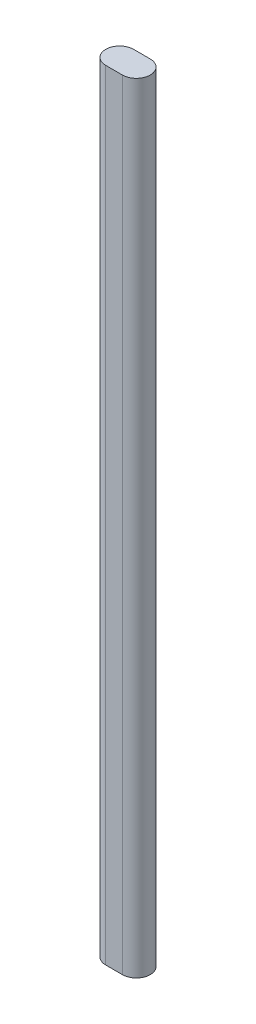
ISO-10303-21;
HEADER;
FILE_DESCRIPTION(('STEP AP214'),'2;1');
FILE_NAME('part.step','',(''),(''),'','','');
FILE_SCHEMA(('AUTOMOTIVE_DESIGN { 1 0 10303 214 1 1 1 1 }'));
ENDSEC;
DATA;
#1=APPLICATION_CONTEXT('core data for automotive mechanical design processes');
#2=APPLICATION_PROTOCOL_DEFINITION('international standard','automotive_design',2000,#1);
#3=PRODUCT_CONTEXT('',#1,'mechanical');
#4=PRODUCT('Part','Part','',(#3));
#5=PRODUCT_RELATED_PRODUCT_CATEGORY('part','',(#4));
#6=PRODUCT_DEFINITION_FORMATION('','',#4);
#7=PRODUCT_DEFINITION_CONTEXT('part definition',#1,'design');
#8=PRODUCT_DEFINITION('design','',#6,#7);
#9=PRODUCT_DEFINITION_SHAPE('','',#8);
#10=(LENGTH_UNIT() NAMED_UNIT(*) SI_UNIT(.MILLI.,.METRE.));
#11=(NAMED_UNIT(*) PLANE_ANGLE_UNIT() SI_UNIT($,.RADIAN.));
#12=(NAMED_UNIT(*) SI_UNIT($,.STERADIAN.) SOLID_ANGLE_UNIT());
#13=UNCERTAINTY_MEASURE_WITH_UNIT(LENGTH_MEASURE(1.E-05),#10,'distance_accuracy_value','');
#14=(GEOMETRIC_REPRESENTATION_CONTEXT(3) GLOBAL_UNCERTAINTY_ASSIGNED_CONTEXT((#13)) GLOBAL_UNIT_ASSIGNED_CONTEXT((#10,
#11,#12)) REPRESENTATION_CONTEXT('',''));
#15=CARTESIAN_POINT('',(0.,0.,0.));
#16=DIRECTION('',(0.,0.,1.));
#17=DIRECTION('',(1.,0.,0.));
#18=AXIS2_PLACEMENT_3D('',#15,#16,#17);
#19=CARTESIAN_POINT('',(0.,-700.,0.));
#20=DIRECTION('',(0.,1.,0.));
#21=DIRECTION('',(0.,0.,1.));
#22=AXIS2_PLACEMENT_3D('',#19,#20,#21);
#23=CYLINDRICAL_SURFACE('',#22,12.5);
#24=CARTESIAN_POINT('',(0.,0.,0.));
#25=DIRECTION('',(0.,1.,0.));
#26=DIRECTION('',(0.,0.,1.));
#27=AXIS2_PLACEMENT_3D('',#24,#25,#26);
#28=CIRCLE('',#27,12.5);
#29=CARTESIAN_POINT('',(0.,0.,12.5));
#30=VERTEX_POINT('',#29);
#31=CARTESIAN_POINT('',(0.,0.,-12.5));
#32=VERTEX_POINT('',#31);
#33=EDGE_CURVE('E109',#30,#32,#28,.T.);
#34=ORIENTED_EDGE('',*,*,#33,.F.);
#35=DIRECTION('',(0.,1.,0.));
#36=VECTOR('',#35,1.);
#37=CARTESIAN_POINT('',(0.,-700.,12.5));
#38=LINE('',#37,#36);
#39=CARTESIAN_POINT('',(0.,-700.,12.5));
#40=VERTEX_POINT('',#39);
#41=EDGE_CURVE('E11',#40,#30,#38,.T.);
#42=ORIENTED_EDGE('',*,*,#41,.F.);
#43=CARTESIAN_POINT('',(0.,-700.,0.));
#44=DIRECTION('',(0.,1.,0.));
#45=DIRECTION('',(0.,0.,1.));
#46=AXIS2_PLACEMENT_3D('',#43,#44,#45);
#47=CIRCLE('',#46,12.5);
#48=CARTESIAN_POINT('',(0.,-700.,-12.5));
#49=VERTEX_POINT('',#48);
#50=EDGE_CURVE('E101',#40,#49,#47,.T.);
#51=ORIENTED_EDGE('',*,*,#50,.T.);
#52=DIRECTION('',(0.,1.,0.));
#53=VECTOR('',#52,1.);
#54=CARTESIAN_POINT('',(0.,-700.,-12.5));
#55=LINE('',#54,#53);
#56=EDGE_CURVE('E42',#49,#32,#55,.T.);
#57=ORIENTED_EDGE('',*,*,#56,.T.);
#58=EDGE_LOOP('',(#34,#42,#51,#57));
#59=FACE_BOUND('',#58,.T.);
#60=ADVANCED_FACE('F39',(#59),#23,.T.);
#61=CARTESIAN_POINT('',(0.,-700.,12.5));
#62=DIRECTION('',(0.,0.,1.));
#63=DIRECTION('',(1.,0.,0.));
#64=AXIS2_PLACEMENT_3D('',#61,#62,#63);
#65=PLANE('',#64);
#66=DIRECTION('',(1.,0.,0.));
#67=VECTOR('',#66,1.);
#68=CARTESIAN_POINT('',(0.,0.,12.5));
#69=LINE('',#68,#67);
#70=CARTESIAN_POINT('',(-15.,0.,12.5));
#71=VERTEX_POINT('',#70);
#72=EDGE_CURVE('E104',#71,#30,#69,.T.);
#73=ORIENTED_EDGE('',*,*,#72,.F.);
#74=DIRECTION('',(0.,1.,0.));
#75=VECTOR('',#74,1.);
#76=CARTESIAN_POINT('',(-15.,-700.,12.5));
#77=LINE('',#76,#75);
#78=CARTESIAN_POINT('',(-15.,-700.,12.5));
#79=VERTEX_POINT('',#78);
#80=EDGE_CURVE('E49',#79,#71,#77,.T.);
#81=ORIENTED_EDGE('',*,*,#80,.F.);
#82=DIRECTION('',(1.,0.,0.));
#83=VECTOR('',#82,1.);
#84=CARTESIAN_POINT('',(0.,-700.,12.5));
#85=LINE('',#84,#83);
#86=EDGE_CURVE('E96',#79,#40,#85,.T.);
#87=ORIENTED_EDGE('',*,*,#86,.T.);
#88=ORIENTED_EDGE('',*,*,#41,.T.);
#89=EDGE_LOOP('',(#73,#81,#87,#88));
#90=FACE_BOUND('',#89,.T.);
#91=ADVANCED_FACE('F125',(#90),#65,.T.);
#92=CARTESIAN_POINT('',(-15.,-700.,0.));
#93=DIRECTION('',(0.,1.,0.));
#94=DIRECTION('',(0.,0.,1.));
#95=AXIS2_PLACEMENT_3D('',#92,#93,#94);
#96=CYLINDRICAL_SURFACE('',#95,12.5);
#97=CARTESIAN_POINT('',(-15.,0.,0.));
#98=DIRECTION('',(0.,1.,0.));
#99=DIRECTION('',(0.,0.,1.));
#100=AXIS2_PLACEMENT_3D('',#97,#98,#99);
#101=CIRCLE('',#100,12.5);
#102=CARTESIAN_POINT('',(-15.,0.,-12.5));
#103=VERTEX_POINT('',#102);
#104=EDGE_CURVE('E90',#103,#71,#101,.T.);
#105=ORIENTED_EDGE('',*,*,#104,.F.);
#106=DIRECTION('',(0.,1.,0.));
#107=VECTOR('',#106,1.);
#108=CARTESIAN_POINT('',(-15.,-700.,-12.5));
#109=LINE('',#108,#107);
#110=CARTESIAN_POINT('',(-15.,-700.,-12.5));
#111=VERTEX_POINT('',#110);
#112=EDGE_CURVE('E85',#111,#103,#109,.T.);
#113=ORIENTED_EDGE('',*,*,#112,.F.);
#114=CARTESIAN_POINT('',(-15.,-700.,0.));
#115=DIRECTION('',(0.,1.,0.));
#116=DIRECTION('',(0.,0.,1.));
#117=AXIS2_PLACEMENT_3D('',#114,#115,#116);
#118=CIRCLE('',#117,12.5);
#119=EDGE_CURVE('E88',#111,#79,#118,.T.);
#120=ORIENTED_EDGE('',*,*,#119,.T.);
#121=ORIENTED_EDGE('',*,*,#80,.T.);
#122=EDGE_LOOP('',(#105,#113,#120,#121));
#123=FACE_BOUND('',#122,.T.);
#124=ADVANCED_FACE('F87',(#123),#96,.T.);
#125=CARTESIAN_POINT('',(0.,-700.,-12.5));
#126=DIRECTION('',(0.,0.,-1.));
#127=DIRECTION('',(-1.,0.,0.));
#128=AXIS2_PLACEMENT_3D('',#125,#126,#127);
#129=PLANE('',#128);
#130=DIRECTION('',(-1.,0.,0.));
#131=VECTOR('',#130,1.);
#132=CARTESIAN_POINT('',(0.,0.,-12.5));
#133=LINE('',#132,#131);
#134=EDGE_CURVE('E113',#32,#103,#133,.T.);
#135=ORIENTED_EDGE('',*,*,#134,.F.);
#136=ORIENTED_EDGE('',*,*,#56,.F.);
#137=DIRECTION('',(-1.,0.,0.));
#138=VECTOR('',#137,1.);
#139=CARTESIAN_POINT('',(0.,-700.,-12.5));
#140=LINE('',#139,#138);
#141=EDGE_CURVE('E95',#49,#111,#140,.T.);
#142=ORIENTED_EDGE('',*,*,#141,.T.);
#143=ORIENTED_EDGE('',*,*,#112,.T.);
#144=EDGE_LOOP('',(#135,#136,#142,#143));
#145=FACE_BOUND('',#144,.T.);
#146=ADVANCED_FACE('F99',(#145),#129,.T.);
#147=CARTESIAN_POINT('',(0.,-700.,0.));
#148=DIRECTION('',(0.,1.,0.));
#149=DIRECTION('',(0.,0.,1.));
#150=AXIS2_PLACEMENT_3D('',#147,#148,#149);
#151=PLANE('',#150);
#152=ORIENTED_EDGE('',*,*,#50,.F.);
#153=ORIENTED_EDGE('',*,*,#86,.F.);
#154=ORIENTED_EDGE('',*,*,#119,.F.);
#155=ORIENTED_EDGE('',*,*,#141,.F.);
#156=EDGE_LOOP('',(#152,#153,#154,#155));
#157=FACE_BOUND('',#156,.T.);
#158=ADVANCED_FACE('F94',(#157),#151,.F.);
#159=CARTESIAN_POINT('',(0.,0.,0.));
#160=DIRECTION('',(0.,1.,0.));
#161=DIRECTION('',(0.,0.,1.));
#162=AXIS2_PLACEMENT_3D('',#159,#160,#161);
#163=PLANE('',#162);
#164=ORIENTED_EDGE('',*,*,#33,.T.);
#165=ORIENTED_EDGE('',*,*,#134,.T.);
#166=ORIENTED_EDGE('',*,*,#104,.T.);
#167=ORIENTED_EDGE('',*,*,#72,.T.);
#168=EDGE_LOOP('',(#164,#165,#166,#167));
#169=FACE_BOUND('',#168,.T.);
#170=ADVANCED_FACE('F124',(#169),#163,.T.);
#171=CLOSED_SHELL('',(#60,#91,#124,#146,#158,#170));
#172=MANIFOLD_SOLID_BREP('B2',#171);
#173=ADVANCED_BREP_SHAPE_REPRESENTATION('',(#18,#172),#14);
#174=SHAPE_DEFINITION_REPRESENTATION(#9,#173);
ENDSEC;
END-ISO-10303-21;
